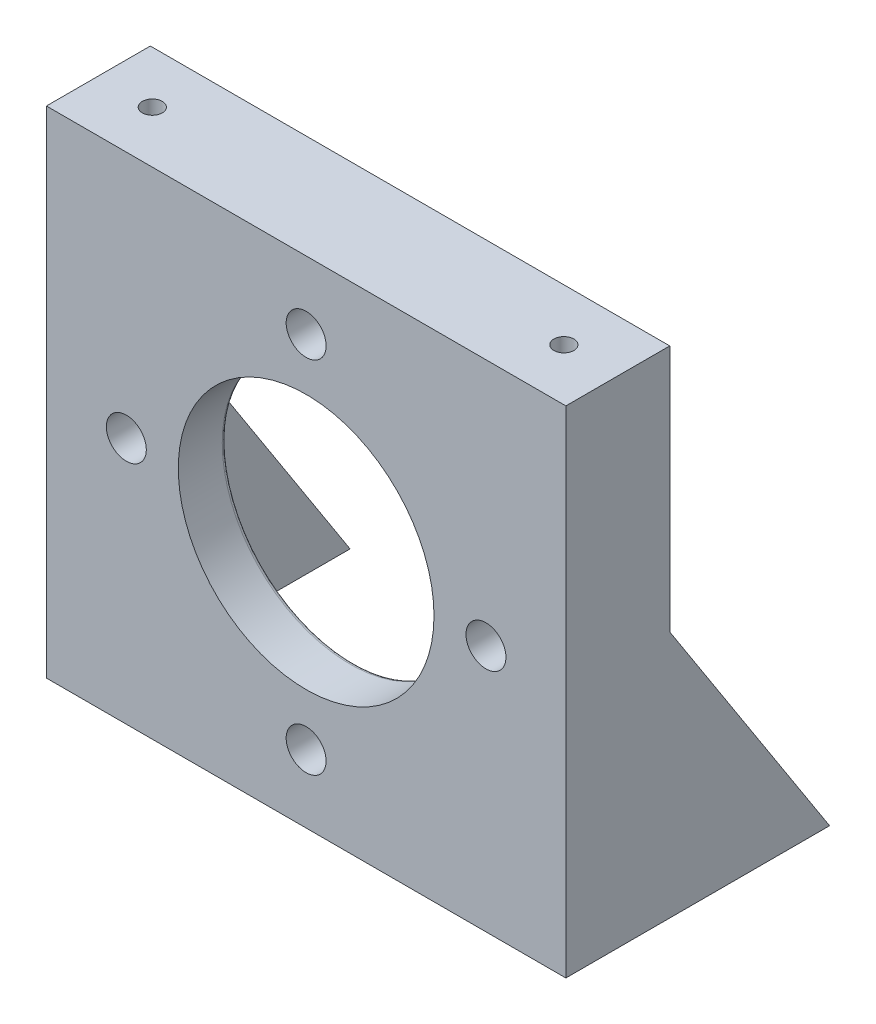
ISO-10303-21;
HEADER;
FILE_DESCRIPTION(('STEP AP214'),'2;1');
FILE_NAME('part.step','',(''),(''),'','','');
FILE_SCHEMA(('AUTOMOTIVE_DESIGN { 1 0 10303 214 1 1 1 1 }'));
ENDSEC;
DATA;
#1=APPLICATION_CONTEXT('core data for automotive mechanical design processes');
#2=APPLICATION_PROTOCOL_DEFINITION('international standard','automotive_design',2000,#1);
#3=PRODUCT_CONTEXT('',#1,'mechanical');
#4=PRODUCT('Part','Part','',(#3));
#5=PRODUCT_RELATED_PRODUCT_CATEGORY('part','',(#4));
#6=PRODUCT_DEFINITION_FORMATION('','',#4);
#7=PRODUCT_DEFINITION_CONTEXT('part definition',#1,'design');
#8=PRODUCT_DEFINITION('design','',#6,#7);
#9=PRODUCT_DEFINITION_SHAPE('','',#8);
#10=(LENGTH_UNIT() NAMED_UNIT(*) SI_UNIT(.MILLI.,.METRE.));
#11=(NAMED_UNIT(*) PLANE_ANGLE_UNIT() SI_UNIT($,.RADIAN.));
#12=(NAMED_UNIT(*) SI_UNIT($,.STERADIAN.) SOLID_ANGLE_UNIT());
#13=UNCERTAINTY_MEASURE_WITH_UNIT(LENGTH_MEASURE(1.E-05),#10,'distance_accuracy_value','');
#14=(GEOMETRIC_REPRESENTATION_CONTEXT(3) GLOBAL_UNCERTAINTY_ASSIGNED_CONTEXT((#13)) GLOBAL_UNIT_ASSIGNED_CONTEXT((#10,
#11,#12)) REPRESENTATION_CONTEXT('',''));
#15=CARTESIAN_POINT('',(0.,0.,0.));
#16=DIRECTION('',(0.,0.,1.));
#17=DIRECTION('',(1.,0.,0.));
#18=AXIS2_PLACEMENT_3D('',#15,#16,#17);
#19=CARTESIAN_POINT('',(0.,0.,-33.));
#20=DIRECTION('',(0.,0.,1.));
#21=DIRECTION('',(1.,0.,0.));
#22=AXIS2_PLACEMENT_3D('',#19,#20,#21);
#23=CYLINDRICAL_SURFACE('',#22,16.);
#24=CARTESIAN_POINT('',(0.,0.,-5.5));
#25=DIRECTION('',(0.,0.,-1.));
#26=DIRECTION('',(-1.,0.,0.));
#27=AXIS2_PLACEMENT_3D('',#24,#25,#26);
#28=CIRCLE('',#27,16.);
#29=CARTESIAN_POINT('',(-16.,0.,-5.5));
#30=VERTEX_POINT('',#29);
#31=EDGE_CURVE('E250',#30,#30,#28,.T.);
#32=ORIENTED_EDGE('',*,*,#31,.T.);
#33=EDGE_LOOP('',(#32));
#34=FACE_BOUND('',#33,.T.);
#35=CARTESIAN_POINT('',(0.,0.,0.));
#36=DIRECTION('',(0.,0.,1.));
#37=DIRECTION('',(1.,0.,0.));
#38=AXIS2_PLACEMENT_3D('',#35,#36,#37);
#39=CIRCLE('',#38,16.);
#40=CARTESIAN_POINT('',(16.,0.,0.));
#41=VERTEX_POINT('',#40);
#42=EDGE_CURVE('E172',#41,#41,#39,.T.);
#43=ORIENTED_EDGE('',*,*,#42,.T.);
#44=EDGE_LOOP('',(#43));
#45=FACE_BOUND('',#44,.T.);
#46=ADVANCED_FACE('F33',(#34,#45),#23,.F.);
#47=CARTESIAN_POINT('',(69.3917334913934,0.,-13.));
#48=DIRECTION('',(0.,-0.542126869822093,0.840296648224244));
#49=DIRECTION('',(0.,-0.840296648224244,-0.542126869822093));
#50=AXIS2_PLACEMENT_3D('',#47,#48,#49);
#51=PLANE('',#50);
#52=DIRECTION('',(-1.,0.,0.));
#53=VECTOR('',#52,1.);
#54=CARTESIAN_POINT('',(69.3917334913934,0.,-13.));
#55=LINE('',#54,#53);
#56=CARTESIAN_POINT('',(-27.5,0.,-13.));
#57=VERTEX_POINT('',#56);
#58=CARTESIAN_POINT('',(-32.5,0.,-13.));
#59=VERTEX_POINT('',#58);
#60=EDGE_CURVE('E53',#57,#59,#55,.T.);
#61=ORIENTED_EDGE('',*,*,#60,.F.);
#62=DIRECTION('',(0.,-0.840296648224244,-0.542126869822093));
#63=VECTOR('',#62,1.);
#64=CARTESIAN_POINT('',(-27.5,0.,-13.));
#65=LINE('',#64,#63);
#66=CARTESIAN_POINT('',(-27.5,-31.,-33.));
#67=VERTEX_POINT('',#66);
#68=EDGE_CURVE('E231',#57,#67,#65,.T.);
#69=ORIENTED_EDGE('',*,*,#68,.T.);
#70=DIRECTION('',(-1.,0.,0.));
#71=VECTOR('',#70,1.);
#72=CARTESIAN_POINT('',(69.3917334913934,-31.,-33.));
#73=LINE('',#72,#71);
#74=CARTESIAN_POINT('',(-32.5,-31.,-33.));
#75=VERTEX_POINT('',#74);
#76=EDGE_CURVE('E197',#67,#75,#73,.T.);
#77=ORIENTED_EDGE('',*,*,#76,.T.);
#78=DIRECTION('',(0.,0.840296648224244,0.542126869822093));
#79=VECTOR('',#78,1.);
#80=CARTESIAN_POINT('',(-32.5,0.,-13.));
#81=LINE('',#80,#79);
#82=EDGE_CURVE('E187',#75,#59,#81,.T.);
#83=ORIENTED_EDGE('',*,*,#82,.T.);
#84=EDGE_LOOP('',(#61,#69,#77,#83));
#85=FACE_BOUND('',#84,.T.);
#86=ADVANCED_FACE('F320',(#85),#51,.F.);
#87=CARTESIAN_POINT('',(0.,0.,-13.));
#88=DIRECTION('',(0.,0.,-1.));
#89=DIRECTION('',(-1.,0.,0.));
#90=AXIS2_PLACEMENT_3D('',#87,#88,#89);
#91=PLANE('',#90);
#92=CARTESIAN_POINT('',(0.,0.,-13.));
#93=DIRECTION('',(0.,0.,-1.));
#94=DIRECTION('',(-1.,0.,0.));
#95=AXIS2_PLACEMENT_3D('',#92,#93,#94);
#96=CIRCLE('',#95,26.5);
#97=CARTESIAN_POINT('',(-26.5,0.,-13.));
#98=VERTEX_POINT('',#97);
#99=EDGE_CURVE('E11',#98,#98,#96,.F.);
#100=ORIENTED_EDGE('',*,*,#99,.T.);
#101=EDGE_LOOP('',(#100));
#102=FACE_BOUND('',#101,.T.);
#103=DIRECTION('',(0.,1.,0.));
#104=VECTOR('',#103,1.);
#105=CARTESIAN_POINT('',(32.5,-31.,-13.));
#106=LINE('',#105,#104);
#107=CARTESIAN_POINT('',(32.5,0.,-13.));
#108=VERTEX_POINT('',#107);
#109=CARTESIAN_POINT('',(32.5,31.,-13.));
#110=VERTEX_POINT('',#109);
#111=EDGE_CURVE('E201',#108,#110,#106,.T.);
#112=ORIENTED_EDGE('',*,*,#111,.F.);
#113=CARTESIAN_POINT('',(27.5,0.,-13.));
#114=VERTEX_POINT('',#113);
#115=EDGE_CURVE('E198',#108,#114,#55,.T.);
#116=ORIENTED_EDGE('',*,*,#115,.T.);
#117=DIRECTION('',(0.,1.,0.));
#118=VECTOR('',#117,1.);
#119=CARTESIAN_POINT('',(27.5,-31.,-13.));
#120=LINE('',#119,#118);
#121=CARTESIAN_POINT('',(27.5,-31.,-13.));
#122=VERTEX_POINT('',#121);
#123=EDGE_CURVE('E185',#122,#114,#120,.T.);
#124=ORIENTED_EDGE('',*,*,#123,.F.);
#125=DIRECTION('',(1.,0.,0.));
#126=VECTOR('',#125,1.);
#127=CARTESIAN_POINT('',(27.5,-31.,-13.));
#128=LINE('',#127,#126);
#129=CARTESIAN_POINT('',(-27.5,-31.,-13.));
#130=VERTEX_POINT('',#129);
#131=EDGE_CURVE('E179',#130,#122,#128,.T.);
#132=ORIENTED_EDGE('',*,*,#131,.F.);
#133=DIRECTION('',(0.,1.,0.));
#134=VECTOR('',#133,1.);
#135=CARTESIAN_POINT('',(-27.5,-31.,-13.));
#136=LINE('',#135,#134);
#137=EDGE_CURVE('E48',#130,#57,#136,.T.);
#138=ORIENTED_EDGE('',*,*,#137,.T.);
#139=ORIENTED_EDGE('',*,*,#60,.T.);
#140=DIRECTION('',(0.,-1.,0.));
#141=VECTOR('',#140,1.);
#142=CARTESIAN_POINT('',(-32.5,-31.,-13.));
#143=LINE('',#142,#141);
#144=CARTESIAN_POINT('',(-32.5,31.,-13.));
#145=VERTEX_POINT('',#144);
#146=EDGE_CURVE('E207',#145,#59,#143,.T.);
#147=ORIENTED_EDGE('',*,*,#146,.F.);
#148=DIRECTION('',(-1.,0.,0.));
#149=VECTOR('',#148,1.);
#150=CARTESIAN_POINT('',(-32.5,31.,-13.));
#151=LINE('',#150,#149);
#152=EDGE_CURVE('E203',#110,#145,#151,.T.);
#153=ORIENTED_EDGE('',*,*,#152,.F.);
#154=EDGE_LOOP('',(#112,#116,#124,#132,#138,#139,#147,#153));
#155=FACE_BOUND('',#154,.T.);
#156=ADVANCED_FACE('F318',(#102,#155),#91,.T.);
#157=CARTESIAN_POINT('',(32.5,-31.,-13.));
#158=DIRECTION('',(1.,0.,0.));
#159=DIRECTION('',(0.,0.,-1.));
#160=AXIS2_PLACEMENT_3D('',#157,#158,#159);
#161=PLANE('',#160);
#162=DIRECTION('',(0.,1.,0.));
#163=VECTOR('',#162,1.);
#164=CARTESIAN_POINT('',(32.5,-31.,0.));
#165=LINE('',#164,#163);
#166=CARTESIAN_POINT('',(32.5,-31.,0.));
#167=VERTEX_POINT('',#166);
#168=CARTESIAN_POINT('',(32.5,31.,0.));
#169=VERTEX_POINT('',#168);
#170=EDGE_CURVE('E193',#167,#169,#165,.T.);
#171=ORIENTED_EDGE('',*,*,#170,.F.);
#172=DIRECTION('',(0.,0.,1.));
#173=VECTOR('',#172,1.);
#174=CARTESIAN_POINT('',(32.5,-31.,-13.));
#175=LINE('',#174,#173);
#176=CARTESIAN_POINT('',(32.5,-31.,-33.));
#177=VERTEX_POINT('',#176);
#178=EDGE_CURVE('E221',#177,#167,#175,.T.);
#179=ORIENTED_EDGE('',*,*,#178,.F.);
#180=DIRECTION('',(0.,0.840296648224244,0.542126869822093));
#181=VECTOR('',#180,1.);
#182=CARTESIAN_POINT('',(32.5,0.,-13.));
#183=LINE('',#182,#181);
#184=EDGE_CURVE('E190',#177,#108,#183,.T.);
#185=ORIENTED_EDGE('',*,*,#184,.T.);
#186=ORIENTED_EDGE('',*,*,#111,.T.);
#187=DIRECTION('',(0.,0.,1.));
#188=VECTOR('',#187,1.);
#189=CARTESIAN_POINT('',(32.5,31.,-13.));
#190=LINE('',#189,#188);
#191=EDGE_CURVE('E210',#110,#169,#190,.T.);
#192=ORIENTED_EDGE('',*,*,#191,.T.);
#193=EDGE_LOOP('',(#171,#179,#185,#186,#192));
#194=FACE_BOUND('',#193,.T.);
#195=ADVANCED_FACE('F301',(#194),#161,.T.);
#196=CARTESIAN_POINT('',(-32.5,-31.,-13.));
#197=DIRECTION('',(0.,-1.,0.));
#198=DIRECTION('',(0.,0.,-1.));
#199=AXIS2_PLACEMENT_3D('',#196,#197,#198);
#200=PLANE('',#199);
#201=CARTESIAN_POINT('',(-30.,-31.,-21.65));
#202=DIRECTION('',(0.,-1.,0.));
#203=DIRECTION('',(0.,0.,-1.));
#204=AXIS2_PLACEMENT_3D('',#201,#202,#203);
#205=CIRCLE('',#204,1.25);
#206=CARTESIAN_POINT('',(-30.,-31.,-22.9));
#207=VERTEX_POINT('',#206);
#208=EDGE_CURVE('E135',#207,#207,#205,.T.);
#209=ORIENTED_EDGE('',*,*,#208,.F.);
#210=EDGE_LOOP('',(#209));
#211=FACE_BOUND('',#210,.T.);
#212=CARTESIAN_POINT('',(30.,-31.,-21.65));
#213=DIRECTION('',(0.,-1.,0.));
#214=DIRECTION('',(0.,0.,-1.));
#215=AXIS2_PLACEMENT_3D('',#212,#213,#214);
#216=CIRCLE('',#215,1.25);
#217=CARTESIAN_POINT('',(30.,-31.,-22.9));
#218=VERTEX_POINT('',#217);
#219=EDGE_CURVE('E141',#218,#218,#216,.T.);
#220=ORIENTED_EDGE('',*,*,#219,.F.);
#221=EDGE_LOOP('',(#220));
#222=FACE_BOUND('',#221,.T.);
#223=CARTESIAN_POINT('',(-27.,-31.,-6.5));
#224=DIRECTION('',(0.,-1.,0.));
#225=DIRECTION('',(0.,0.,-1.));
#226=AXIS2_PLACEMENT_3D('',#223,#224,#225);
#227=CIRCLE('',#226,2.1);
#228=CARTESIAN_POINT('',(-27.,-31.,-8.6));
#229=VERTEX_POINT('',#228);
#230=EDGE_CURVE('E147',#229,#229,#227,.T.);
#231=ORIENTED_EDGE('',*,*,#230,.F.);
#232=EDGE_LOOP('',(#231));
#233=FACE_BOUND('',#232,.T.);
#234=CARTESIAN_POINT('',(27.,-31.,-6.5));
#235=DIRECTION('',(0.,-1.,0.));
#236=DIRECTION('',(0.,0.,-1.));
#237=AXIS2_PLACEMENT_3D('',#234,#235,#236);
#238=CIRCLE('',#237,2.1);
#239=CARTESIAN_POINT('',(27.,-31.,-8.6));
#240=VERTEX_POINT('',#239);
#241=EDGE_CURVE('E153',#240,#240,#238,.T.);
#242=ORIENTED_EDGE('',*,*,#241,.F.);
#243=EDGE_LOOP('',(#242));
#244=FACE_BOUND('',#243,.T.);
#245=DIRECTION('',(0.,0.,1.));
#246=VECTOR('',#245,1.);
#247=CARTESIAN_POINT('',(-27.5,-31.,-13.));
#248=LINE('',#247,#246);
#249=EDGE_CURVE('E175',#67,#130,#248,.T.);
#250=ORIENTED_EDGE('',*,*,#249,.T.);
#251=ORIENTED_EDGE('',*,*,#131,.T.);
#252=DIRECTION('',(0.,0.,-1.));
#253=VECTOR('',#252,1.);
#254=CARTESIAN_POINT('',(27.5,-31.,-13.));
#255=LINE('',#254,#253);
#256=CARTESIAN_POINT('',(27.5,-31.,-33.));
#257=VERTEX_POINT('',#256);
#258=EDGE_CURVE('E182',#122,#257,#255,.T.);
#259=ORIENTED_EDGE('',*,*,#258,.T.);
#260=EDGE_CURVE('E194',#177,#257,#73,.T.);
#261=ORIENTED_EDGE('',*,*,#260,.F.);
#262=ORIENTED_EDGE('',*,*,#178,.T.);
#263=DIRECTION('',(1.,0.,0.));
#264=VECTOR('',#263,1.);
#265=CARTESIAN_POINT('',(-32.5,-31.,0.));
#266=LINE('',#265,#264);
#267=CARTESIAN_POINT('',(-32.5,-31.,0.));
#268=VERTEX_POINT('',#267);
#269=EDGE_CURVE('E204',#268,#167,#266,.T.);
#270=ORIENTED_EDGE('',*,*,#269,.F.);
#271=DIRECTION('',(0.,0.,1.));
#272=VECTOR('',#271,1.);
#273=CARTESIAN_POINT('',(-32.5,-31.,-13.));
#274=LINE('',#273,#272);
#275=EDGE_CURVE('E224',#75,#268,#274,.T.);
#276=ORIENTED_EDGE('',*,*,#275,.F.);
#277=ORIENTED_EDGE('',*,*,#76,.F.);
#278=EDGE_LOOP('',(#250,#251,#259,#261,#262,#270,#276,#277));
#279=FACE_BOUND('',#278,.T.);
#280=ADVANCED_FACE('F313',(#211,#222,#233,#244,#279),#200,.T.);
#281=CARTESIAN_POINT('',(-32.5,-31.,-13.));
#282=DIRECTION('',(-1.,0.,0.));
#283=DIRECTION('',(0.,0.,1.));
#284=AXIS2_PLACEMENT_3D('',#281,#282,#283);
#285=PLANE('',#284);
#286=DIRECTION('',(0.,-1.,0.));
#287=VECTOR('',#286,1.);
#288=CARTESIAN_POINT('',(-32.5,-31.,0.));
#289=LINE('',#288,#287);
#290=CARTESIAN_POINT('',(-32.5,31.,0.));
#291=VERTEX_POINT('',#290);
#292=EDGE_CURVE('E216',#291,#268,#289,.T.);
#293=ORIENTED_EDGE('',*,*,#292,.F.);
#294=DIRECTION('',(0.,0.,1.));
#295=VECTOR('',#294,1.);
#296=CARTESIAN_POINT('',(-32.5,31.,-13.));
#297=LINE('',#296,#295);
#298=EDGE_CURVE('E226',#145,#291,#297,.T.);
#299=ORIENTED_EDGE('',*,*,#298,.F.);
#300=ORIENTED_EDGE('',*,*,#146,.T.);
#301=ORIENTED_EDGE('',*,*,#82,.F.);
#302=ORIENTED_EDGE('',*,*,#275,.T.);
#303=EDGE_LOOP('',(#293,#299,#300,#301,#302));
#304=FACE_BOUND('',#303,.T.);
#305=ADVANCED_FACE('F309',(#304),#285,.T.);
#306=CARTESIAN_POINT('',(-32.5,31.,-13.));
#307=DIRECTION('',(0.,1.,0.));
#308=DIRECTION('',(0.,0.,1.));
#309=AXIS2_PLACEMENT_3D('',#306,#307,#308);
#310=PLANE('',#309);
#311=CARTESIAN_POINT('',(25.75,31.,-6.49999999999998));
#312=DIRECTION('',(0.,1.,0.));
#313=DIRECTION('',(0.,0.,1.));
#314=AXIS2_PLACEMENT_3D('',#311,#312,#313);
#315=CIRCLE('',#314,1.24999999999999);
#316=CARTESIAN_POINT('',(25.75,31.,-5.24999999999999));
#317=VERTEX_POINT('',#316);
#318=EDGE_CURVE('E125',#317,#317,#315,.T.);
#319=ORIENTED_EDGE('',*,*,#318,.F.);
#320=EDGE_LOOP('',(#319));
#321=FACE_BOUND('',#320,.T.);
#322=CARTESIAN_POINT('',(-25.75,31.,-6.5));
#323=DIRECTION('',(0.,1.,0.));
#324=DIRECTION('',(0.,0.,1.));
#325=AXIS2_PLACEMENT_3D('',#322,#323,#324);
#326=CIRCLE('',#325,1.24999999999999);
#327=CARTESIAN_POINT('',(-25.75,31.,-5.25000000000001));
#328=VERTEX_POINT('',#327);
#329=EDGE_CURVE('E124',#328,#328,#326,.T.);
#330=ORIENTED_EDGE('',*,*,#329,.F.);
#331=EDGE_LOOP('',(#330));
#332=FACE_BOUND('',#331,.T.);
#333=DIRECTION('',(-1.,0.,0.));
#334=VECTOR('',#333,1.);
#335=CARTESIAN_POINT('',(-32.5,31.,0.));
#336=LINE('',#335,#334);
#337=EDGE_CURVE('E213',#169,#291,#336,.T.);
#338=ORIENTED_EDGE('',*,*,#337,.F.);
#339=ORIENTED_EDGE('',*,*,#191,.F.);
#340=ORIENTED_EDGE('',*,*,#152,.T.);
#341=ORIENTED_EDGE('',*,*,#298,.T.);
#342=EDGE_LOOP('',(#338,#339,#340,#341));
#343=FACE_BOUND('',#342,.T.);
#344=ADVANCED_FACE('F292',(#321,#332,#343),#310,.T.);
#345=CARTESIAN_POINT('',(0.,0.,0.));
#346=DIRECTION('',(0.,0.,-1.));
#347=DIRECTION('',(-1.,0.,0.));
#348=AXIS2_PLACEMENT_3D('',#345,#346,#347);
#349=PLANE('',#348);
#350=CARTESIAN_POINT('',(0.,22.5,0.));
#351=DIRECTION('',(0.,0.,1.));
#352=DIRECTION('',(1.,0.,0.));
#353=AXIS2_PLACEMENT_3D('',#350,#351,#352);
#354=CIRCLE('',#353,2.5);
#355=CARTESIAN_POINT('',(2.5,22.5,0.));
#356=VERTEX_POINT('',#355);
#357=EDGE_CURVE('E160',#356,#356,#354,.T.);
#358=ORIENTED_EDGE('',*,*,#357,.F.);
#359=EDGE_LOOP('',(#358));
#360=FACE_BOUND('',#359,.T.);
#361=CARTESIAN_POINT('',(22.5,0.,0.));
#362=DIRECTION('',(0.,0.,1.));
#363=DIRECTION('',(1.,0.,0.));
#364=AXIS2_PLACEMENT_3D('',#361,#362,#363);
#365=CIRCLE('',#364,2.5);
#366=CARTESIAN_POINT('',(25.,0.,0.));
#367=VERTEX_POINT('',#366);
#368=EDGE_CURVE('E164',#367,#367,#365,.T.);
#369=ORIENTED_EDGE('',*,*,#368,.F.);
#370=EDGE_LOOP('',(#369));
#371=FACE_BOUND('',#370,.T.);
#372=CARTESIAN_POINT('',(-1.57116660247941E-13,-22.5,0.));
#373=DIRECTION('',(0.,0.,1.));
#374=DIRECTION('',(1.,0.,0.));
#375=AXIS2_PLACEMENT_3D('',#372,#373,#374);
#376=CIRCLE('',#375,2.5);
#377=CARTESIAN_POINT('',(2.49999999999984,-22.5,0.));
#378=VERTEX_POINT('',#377);
#379=EDGE_CURVE('E167',#378,#378,#376,.T.);
#380=ORIENTED_EDGE('',*,*,#379,.F.);
#381=EDGE_LOOP('',(#380));
#382=FACE_BOUND('',#381,.T.);
#383=CARTESIAN_POINT('',(-22.5,2.35674990371912E-13,0.));
#384=DIRECTION('',(0.,0.,1.));
#385=DIRECTION('',(1.,0.,0.));
#386=AXIS2_PLACEMENT_3D('',#383,#384,#385);
#387=CIRCLE('',#386,2.5);
#388=CARTESIAN_POINT('',(-20.,2.35674990371912E-13,0.));
#389=VERTEX_POINT('',#388);
#390=EDGE_CURVE('E159',#389,#389,#387,.T.);
#391=ORIENTED_EDGE('',*,*,#390,.F.);
#392=EDGE_LOOP('',(#391));
#393=FACE_BOUND('',#392,.T.);
#394=ORIENTED_EDGE('',*,*,#42,.F.);
#395=EDGE_LOOP('',(#394));
#396=FACE_BOUND('',#395,.T.);
#397=ORIENTED_EDGE('',*,*,#170,.T.);
#398=ORIENTED_EDGE('',*,*,#337,.T.);
#399=ORIENTED_EDGE('',*,*,#292,.T.);
#400=ORIENTED_EDGE('',*,*,#269,.T.);
#401=EDGE_LOOP('',(#397,#398,#399,#400));
#402=FACE_BOUND('',#401,.T.);
#403=ADVANCED_FACE('F288',(#360,#371,#382,#393,#396,#402),#349,.F.);
#404=ORIENTED_EDGE('',*,*,#260,.T.);
#405=DIRECTION('',(0.,0.840296648224244,0.542126869822093));
#406=VECTOR('',#405,1.);
#407=CARTESIAN_POINT('',(27.5,0.,-13.));
#408=LINE('',#407,#406);
#409=EDGE_CURVE('E223',#257,#114,#408,.T.);
#410=ORIENTED_EDGE('',*,*,#409,.T.);
#411=ORIENTED_EDGE('',*,*,#115,.F.);
#412=ORIENTED_EDGE('',*,*,#184,.F.);
#413=EDGE_LOOP('',(#404,#410,#411,#412));
#414=FACE_BOUND('',#413,.T.);
#415=ADVANCED_FACE('F291',(#414),#51,.F.);
#416=CARTESIAN_POINT('',(-27.5,-31.,-13.));
#417=DIRECTION('',(-1.,0.,0.));
#418=DIRECTION('',(0.,0.,1.));
#419=AXIS2_PLACEMENT_3D('',#416,#417,#418);
#420=PLANE('',#419);
#421=ORIENTED_EDGE('',*,*,#137,.F.);
#422=ORIENTED_EDGE('',*,*,#249,.F.);
#423=ORIENTED_EDGE('',*,*,#68,.F.);
#424=EDGE_LOOP('',(#421,#422,#423));
#425=FACE_BOUND('',#424,.T.);
#426=ADVANCED_FACE('F322',(#425),#420,.F.);
#427=CARTESIAN_POINT('',(27.5,-31.,-13.));
#428=DIRECTION('',(1.,0.,0.));
#429=DIRECTION('',(0.,0.,-1.));
#430=AXIS2_PLACEMENT_3D('',#427,#428,#429);
#431=PLANE('',#430);
#432=ORIENTED_EDGE('',*,*,#258,.F.);
#433=ORIENTED_EDGE('',*,*,#123,.T.);
#434=ORIENTED_EDGE('',*,*,#409,.F.);
#435=EDGE_LOOP('',(#432,#433,#434));
#436=FACE_BOUND('',#435,.T.);
#437=ADVANCED_FACE('F270',(#436),#431,.F.);
#438=CARTESIAN_POINT('',(0.,0.,-6.));
#439=DIRECTION('',(0.,0.,-1.));
#440=DIRECTION('',(-1.,0.,0.));
#441=AXIS2_PLACEMENT_3D('',#438,#439,#440);
#442=PLANE('',#441);
#443=CARTESIAN_POINT('',(0.,0.,-6.));
#444=DIRECTION('',(0.,0.,-1.));
#445=DIRECTION('',(-1.,0.,0.));
#446=AXIS2_PLACEMENT_3D('',#443,#444,#445);
#447=CIRCLE('',#446,16.5);
#448=CARTESIAN_POINT('',(-16.5,0.,-6.));
#449=VERTEX_POINT('',#448);
#450=EDGE_CURVE('E247',#449,#449,#447,.F.);
#451=ORIENTED_EDGE('',*,*,#450,.T.);
#452=EDGE_LOOP('',(#451));
#453=FACE_BOUND('',#452,.T.);
#454=CARTESIAN_POINT('',(0.,0.,-6.));
#455=DIRECTION('',(0.,0.,-1.));
#456=DIRECTION('',(-1.,0.,0.));
#457=AXIS2_PLACEMENT_3D('',#454,#455,#456);
#458=CIRCLE('',#457,25.5);
#459=CARTESIAN_POINT('',(-25.5,0.,-6.));
#460=VERTEX_POINT('',#459);
#461=EDGE_CURVE('E234',#460,#460,#458,.T.);
#462=ORIENTED_EDGE('',*,*,#461,.T.);
#463=EDGE_LOOP('',(#462));
#464=FACE_BOUND('',#463,.T.);
#465=CARTESIAN_POINT('',(0.,22.5,-6.));
#466=DIRECTION('',(0.,0.,-1.));
#467=DIRECTION('',(-1.,0.,0.));
#468=AXIS2_PLACEMENT_3D('',#465,#466,#467);
#469=CIRCLE('',#468,2.5);
#470=CARTESIAN_POINT('',(-2.5,22.5,-6.));
#471=VERTEX_POINT('',#470);
#472=EDGE_CURVE('E176',#471,#471,#469,.T.);
#473=ORIENTED_EDGE('',*,*,#472,.F.);
#474=EDGE_LOOP('',(#473));
#475=FACE_BOUND('',#474,.T.);
#476=CARTESIAN_POINT('',(22.5,0.,-6.));
#477=DIRECTION('',(0.,0.,-1.));
#478=DIRECTION('',(-1.,0.,0.));
#479=AXIS2_PLACEMENT_3D('',#476,#477,#478);
#480=CIRCLE('',#479,2.5);
#481=CARTESIAN_POINT('',(20.,0.,-6.));
#482=VERTEX_POINT('',#481);
#483=EDGE_CURVE('E240',#482,#482,#480,.T.);
#484=ORIENTED_EDGE('',*,*,#483,.F.);
#485=EDGE_LOOP('',(#484));
#486=FACE_BOUND('',#485,.T.);
#487=CARTESIAN_POINT('',(-1.57116660247941E-13,-22.5,-6.));
#488=DIRECTION('',(0.,0.,-1.));
#489=DIRECTION('',(-1.,0.,0.));
#490=AXIS2_PLACEMENT_3D('',#487,#488,#489);
#491=CIRCLE('',#490,2.5);
#492=CARTESIAN_POINT('',(-2.50000000000016,-22.5,-6.));
#493=VERTEX_POINT('',#492);
#494=EDGE_CURVE('E237',#493,#493,#491,.T.);
#495=ORIENTED_EDGE('',*,*,#494,.F.);
#496=EDGE_LOOP('',(#495));
#497=FACE_BOUND('',#496,.T.);
#498=CARTESIAN_POINT('',(-22.5,2.35674990371912E-13,-6.));
#499=DIRECTION('',(0.,0.,-1.));
#500=DIRECTION('',(-1.,0.,0.));
#501=AXIS2_PLACEMENT_3D('',#498,#499,#500);
#502=CIRCLE('',#501,2.5);
#503=CARTESIAN_POINT('',(-25.,2.35674990371912E-13,-6.));
#504=VERTEX_POINT('',#503);
#505=EDGE_CURVE('E163',#504,#504,#502,.T.);
#506=ORIENTED_EDGE('',*,*,#505,.F.);
#507=EDGE_LOOP('',(#506));
#508=FACE_BOUND('',#507,.T.);
#509=ADVANCED_FACE('F267',(#453,#464,#475,#486,#497,#508),#442,.T.);
#510=CARTESIAN_POINT('',(0.,0.,-6.));
#511=DIRECTION('',(0.,0.,-1.));
#512=DIRECTION('',(-1.,0.,0.));
#513=AXIS2_PLACEMENT_3D('',#510,#511,#512);
#514=CYLINDRICAL_SURFACE('',#513,26.);
#515=CARTESIAN_POINT('',(0.,0.,-6.5));
#516=DIRECTION('',(0.,0.,-1.));
#517=DIRECTION('',(-1.,0.,0.));
#518=AXIS2_PLACEMENT_3D('',#515,#516,#517);
#519=CIRCLE('',#518,26.);
#520=CARTESIAN_POINT('',(-26.,0.,-6.5));
#521=VERTEX_POINT('',#520);
#522=EDGE_CURVE('E41',#521,#521,#519,.F.);
#523=ORIENTED_EDGE('',*,*,#522,.T.);
#524=EDGE_LOOP('',(#523));
#525=FACE_BOUND('',#524,.T.);
#526=CARTESIAN_POINT('',(0.,0.,-12.5));
#527=DIRECTION('',(0.,0.,-1.));
#528=DIRECTION('',(-1.,0.,0.));
#529=AXIS2_PLACEMENT_3D('',#526,#527,#528);
#530=CIRCLE('',#529,26.);
#531=CARTESIAN_POINT('',(-26.,0.,-12.5));
#532=VERTEX_POINT('',#531);
#533=EDGE_CURVE('E253',#532,#532,#530,.T.);
#534=ORIENTED_EDGE('',*,*,#533,.T.);
#535=EDGE_LOOP('',(#534));
#536=FACE_BOUND('',#535,.T.);
#537=ADVANCED_FACE('F258',(#525,#536),#514,.F.);
#538=CARTESIAN_POINT('',(-22.5,2.35674990371912E-13,-33.));
#539=DIRECTION('',(0.,0.,1.));
#540=DIRECTION('',(1.,0.,0.));
#541=AXIS2_PLACEMENT_3D('',#538,#539,#540);
#542=CYLINDRICAL_SURFACE('',#541,2.5);
#543=ORIENTED_EDGE('',*,*,#505,.T.);
#544=EDGE_LOOP('',(#543));
#545=FACE_BOUND('',#544,.T.);
#546=ORIENTED_EDGE('',*,*,#390,.T.);
#547=EDGE_LOOP('',(#546));
#548=FACE_BOUND('',#547,.T.);
#549=ADVANCED_FACE('F281',(#545,#548),#542,.F.);
#550=CARTESIAN_POINT('',(-1.57116660247941E-13,-22.5,-33.));
#551=DIRECTION('',(0.,0.,1.));
#552=DIRECTION('',(1.,0.,0.));
#553=AXIS2_PLACEMENT_3D('',#550,#551,#552);
#554=CYLINDRICAL_SURFACE('',#553,2.5);
#555=ORIENTED_EDGE('',*,*,#494,.T.);
#556=EDGE_LOOP('',(#555));
#557=FACE_BOUND('',#556,.T.);
#558=ORIENTED_EDGE('',*,*,#379,.T.);
#559=EDGE_LOOP('',(#558));
#560=FACE_BOUND('',#559,.T.);
#561=ADVANCED_FACE('F284',(#557,#560),#554,.F.);
#562=CARTESIAN_POINT('',(22.5,0.,-33.));
#563=DIRECTION('',(0.,0.,1.));
#564=DIRECTION('',(1.,0.,0.));
#565=AXIS2_PLACEMENT_3D('',#562,#563,#564);
#566=CYLINDRICAL_SURFACE('',#565,2.5);
#567=ORIENTED_EDGE('',*,*,#483,.T.);
#568=EDGE_LOOP('',(#567));
#569=FACE_BOUND('',#568,.T.);
#570=ORIENTED_EDGE('',*,*,#368,.T.);
#571=EDGE_LOOP('',(#570));
#572=FACE_BOUND('',#571,.T.);
#573=ADVANCED_FACE('F343',(#569,#572),#566,.F.);
#574=CARTESIAN_POINT('',(0.,22.5,-33.));
#575=DIRECTION('',(0.,0.,1.));
#576=DIRECTION('',(1.,0.,0.));
#577=AXIS2_PLACEMENT_3D('',#574,#575,#576);
#578=CYLINDRICAL_SURFACE('',#577,2.5);
#579=ORIENTED_EDGE('',*,*,#472,.T.);
#580=EDGE_LOOP('',(#579));
#581=FACE_BOUND('',#580,.T.);
#582=ORIENTED_EDGE('',*,*,#357,.T.);
#583=EDGE_LOOP('',(#582));
#584=FACE_BOUND('',#583,.T.);
#585=ADVANCED_FACE('F347',(#581,#584),#578,.F.);
#586=CARTESIAN_POINT('',(0.,0.,-5.5));
#587=DIRECTION('',(0.,0.,-1.));
#588=DIRECTION('',(-1.,0.,0.));
#589=AXIS2_PLACEMENT_3D('',#586,#587,#588);
#590=TOROIDAL_SURFACE('',#589,16.5,0.5);
#591=ORIENTED_EDGE('',*,*,#31,.F.);
#592=EDGE_LOOP('',(#591));
#593=FACE_BOUND('',#592,.T.);
#594=ORIENTED_EDGE('',*,*,#450,.F.);
#595=EDGE_LOOP('',(#594));
#596=FACE_BOUND('',#595,.T.);
#597=ADVANCED_FACE('F264',(#593,#596),#590,.T.);
#598=CARTESIAN_POINT('',(0.,0.,-6.5));
#599=DIRECTION('',(0.,0.,-1.));
#600=DIRECTION('',(-1.,0.,0.));
#601=AXIS2_PLACEMENT_3D('',#598,#599,#600);
#602=TOROIDAL_SURFACE('',#601,25.5,0.5);
#603=ORIENTED_EDGE('',*,*,#522,.F.);
#604=EDGE_LOOP('',(#603));
#605=FACE_BOUND('',#604,.T.);
#606=ORIENTED_EDGE('',*,*,#461,.F.);
#607=EDGE_LOOP('',(#606));
#608=FACE_BOUND('',#607,.T.);
#609=ADVANCED_FACE('F261',(#605,#608),#602,.F.);
#610=CARTESIAN_POINT('',(0.,0.,-12.5));
#611=DIRECTION('',(0.,0.,-1.));
#612=DIRECTION('',(-1.,0.,0.));
#613=AXIS2_PLACEMENT_3D('',#610,#611,#612);
#614=TOROIDAL_SURFACE('',#613,26.5,0.5);
#615=ORIENTED_EDGE('',*,*,#99,.F.);
#616=EDGE_LOOP('',(#615));
#617=FACE_BOUND('',#616,.T.);
#618=ORIENTED_EDGE('',*,*,#533,.F.);
#619=EDGE_LOOP('',(#618));
#620=FACE_BOUND('',#619,.T.);
#621=ADVANCED_FACE('F35',(#617,#620),#614,.T.);
#622=CARTESIAN_POINT('',(27.,-16.,-6.5));
#623=DIRECTION('',(0.,-1.,0.));
#624=DIRECTION('',(0.,0.,-1.));
#625=AXIS2_PLACEMENT_3D('',#622,#623,#624);
#626=CONICAL_SURFACE('',#625,2.1,1.02974425867665);
#627=CARTESIAN_POINT('',(27.,-14.7381927000421,-6.5));
#628=VERTEX_POINT('',#627);
#629=VERTEX_LOOP('',#628);
#630=FACE_BOUND('',#629,.T.);
#631=CARTESIAN_POINT('',(27.,-16.,-6.5));
#632=DIRECTION('',(0.,-1.,0.));
#633=DIRECTION('',(0.,0.,-1.));
#634=AXIS2_PLACEMENT_3D('',#631,#632,#633);
#635=CIRCLE('',#634,2.1);
#636=CARTESIAN_POINT('',(27.,-16.,-8.6));
#637=VERTEX_POINT('',#636);
#638=EDGE_CURVE('E156',#637,#637,#635,.T.);
#639=ORIENTED_EDGE('',*,*,#638,.T.);
#640=EDGE_LOOP('',(#639));
#641=FACE_BOUND('',#640,.T.);
#642=ADVANCED_FACE('F352',(#630,#641),#626,.F.);
#643=CARTESIAN_POINT('',(27.,-31.,-6.5));
#644=DIRECTION('',(0.,-1.,0.));
#645=DIRECTION('',(0.,0.,-1.));
#646=AXIS2_PLACEMENT_3D('',#643,#644,#645);
#647=CYLINDRICAL_SURFACE('',#646,2.1);
#648=ORIENTED_EDGE('',*,*,#638,.F.);
#649=EDGE_LOOP('',(#648));
#650=FACE_BOUND('',#649,.T.);
#651=ORIENTED_EDGE('',*,*,#241,.T.);
#652=EDGE_LOOP('',(#651));
#653=FACE_BOUND('',#652,.T.);
#654=ADVANCED_FACE('F355',(#650,#653),#647,.F.);
#655=CARTESIAN_POINT('',(-27.,-16.,-6.5));
#656=DIRECTION('',(0.,-1.,0.));
#657=DIRECTION('',(0.,0.,-1.));
#658=AXIS2_PLACEMENT_3D('',#655,#656,#657);
#659=CONICAL_SURFACE('',#658,2.1,1.02974425867665);
#660=CARTESIAN_POINT('',(-27.,-14.7381927000421,-6.5));
#661=VERTEX_POINT('',#660);
#662=VERTEX_LOOP('',#661);
#663=FACE_BOUND('',#662,.T.);
#664=CARTESIAN_POINT('',(-27.,-16.,-6.5));
#665=DIRECTION('',(0.,-1.,0.));
#666=DIRECTION('',(0.,0.,-1.));
#667=AXIS2_PLACEMENT_3D('',#664,#665,#666);
#668=CIRCLE('',#667,2.1);
#669=CARTESIAN_POINT('',(-27.,-16.,-8.6));
#670=VERTEX_POINT('',#669);
#671=EDGE_CURVE('E150',#670,#670,#668,.T.);
#672=ORIENTED_EDGE('',*,*,#671,.T.);
#673=EDGE_LOOP('',(#672));
#674=FACE_BOUND('',#673,.T.);
#675=ADVANCED_FACE('F359',(#663,#674),#659,.F.);
#676=CARTESIAN_POINT('',(-27.,-31.,-6.5));
#677=DIRECTION('',(0.,-1.,0.));
#678=DIRECTION('',(0.,0.,-1.));
#679=AXIS2_PLACEMENT_3D('',#676,#677,#678);
#680=CYLINDRICAL_SURFACE('',#679,2.1);
#681=ORIENTED_EDGE('',*,*,#671,.F.);
#682=EDGE_LOOP('',(#681));
#683=FACE_BOUND('',#682,.T.);
#684=ORIENTED_EDGE('',*,*,#230,.T.);
#685=EDGE_LOOP('',(#684));
#686=FACE_BOUND('',#685,.T.);
#687=ADVANCED_FACE('F363',(#683,#686),#680,.F.);
#688=CARTESIAN_POINT('',(30.,-21.,-21.65));
#689=DIRECTION('',(0.,-1.,0.));
#690=DIRECTION('',(0.,0.,-1.));
#691=AXIS2_PLACEMENT_3D('',#688,#689,#690);
#692=CONICAL_SURFACE('',#691,1.24999999999999,1.02974425867665);
#693=CARTESIAN_POINT('',(30.,-20.2489242262155,-21.65));
#694=VERTEX_POINT('',#693);
#695=VERTEX_LOOP('',#694);
#696=FACE_BOUND('',#695,.T.);
#697=CARTESIAN_POINT('',(30.,-21.,-21.65));
#698=DIRECTION('',(0.,-1.,0.));
#699=DIRECTION('',(0.,0.,-1.));
#700=AXIS2_PLACEMENT_3D('',#697,#698,#699);
#701=CIRCLE('',#700,1.24999999999999);
#702=CARTESIAN_POINT('',(30.,-21.,-22.9));
#703=VERTEX_POINT('',#702);
#704=EDGE_CURVE('E144',#703,#703,#701,.T.);
#705=ORIENTED_EDGE('',*,*,#704,.T.);
#706=EDGE_LOOP('',(#705));
#707=FACE_BOUND('',#706,.T.);
#708=ADVANCED_FACE('F367',(#696,#707),#692,.F.);
#709=CARTESIAN_POINT('',(30.,-31.,-21.65));
#710=DIRECTION('',(0.,-1.,0.));
#711=DIRECTION('',(0.,0.,-1.));
#712=AXIS2_PLACEMENT_3D('',#709,#710,#711);
#713=CYLINDRICAL_SURFACE('',#712,1.25);
#714=ORIENTED_EDGE('',*,*,#704,.F.);
#715=EDGE_LOOP('',(#714));
#716=FACE_BOUND('',#715,.T.);
#717=ORIENTED_EDGE('',*,*,#219,.T.);
#718=EDGE_LOOP('',(#717));
#719=FACE_BOUND('',#718,.T.);
#720=ADVANCED_FACE('F371',(#716,#719),#713,.F.);
#721=CARTESIAN_POINT('',(-30.,-21.,-21.65));
#722=DIRECTION('',(0.,-1.,0.));
#723=DIRECTION('',(0.,0.,-1.));
#724=AXIS2_PLACEMENT_3D('',#721,#722,#723);
#725=CONICAL_SURFACE('',#724,1.25,1.02974425867665);
#726=CARTESIAN_POINT('',(-30.,-20.2489242262155,-21.65));
#727=VERTEX_POINT('',#726);
#728=VERTEX_LOOP('',#727);
#729=FACE_BOUND('',#728,.T.);
#730=CARTESIAN_POINT('',(-30.,-21.,-21.65));
#731=DIRECTION('',(0.,-1.,0.));
#732=DIRECTION('',(0.,0.,-1.));
#733=AXIS2_PLACEMENT_3D('',#730,#731,#732);
#734=CIRCLE('',#733,1.25);
#735=CARTESIAN_POINT('',(-30.,-21.,-22.9));
#736=VERTEX_POINT('',#735);
#737=EDGE_CURVE('E138',#736,#736,#734,.T.);
#738=ORIENTED_EDGE('',*,*,#737,.T.);
#739=EDGE_LOOP('',(#738));
#740=FACE_BOUND('',#739,.T.);
#741=ADVANCED_FACE('F375',(#729,#740),#725,.F.);
#742=CARTESIAN_POINT('',(-30.,-31.,-21.65));
#743=DIRECTION('',(0.,-1.,0.));
#744=DIRECTION('',(0.,0.,-1.));
#745=AXIS2_PLACEMENT_3D('',#742,#743,#744);
#746=CYLINDRICAL_SURFACE('',#745,1.25);
#747=ORIENTED_EDGE('',*,*,#737,.F.);
#748=EDGE_LOOP('',(#747));
#749=FACE_BOUND('',#748,.T.);
#750=ORIENTED_EDGE('',*,*,#208,.T.);
#751=EDGE_LOOP('',(#750));
#752=FACE_BOUND('',#751,.T.);
#753=ADVANCED_FACE('F379',(#749,#752),#746,.F.);
#754=CARTESIAN_POINT('',(-25.75,21.,-6.5));
#755=DIRECTION('',(0.,1.,0.));
#756=DIRECTION('',(0.,0.,1.));
#757=AXIS2_PLACEMENT_3D('',#754,#755,#756);
#758=CONICAL_SURFACE('',#757,1.24999999999999,1.02974425867664);
#759=CARTESIAN_POINT('',(-25.75,20.2489242262155,-6.5));
#760=VERTEX_POINT('',#759);
#761=VERTEX_LOOP('',#760);
#762=FACE_BOUND('',#761,.T.);
#763=CARTESIAN_POINT('',(-25.75,21.,-6.5));
#764=DIRECTION('',(0.,1.,0.));
#765=DIRECTION('',(0.,0.,1.));
#766=AXIS2_PLACEMENT_3D('',#763,#764,#765);
#767=CIRCLE('',#766,1.24999999999999);
#768=CARTESIAN_POINT('',(-25.75,21.,-5.25000000000001));
#769=VERTEX_POINT('',#768);
#770=EDGE_CURVE('E128',#769,#769,#767,.T.);
#771=ORIENTED_EDGE('',*,*,#770,.T.);
#772=EDGE_LOOP('',(#771));
#773=FACE_BOUND('',#772,.T.);
#774=ADVANCED_FACE('F383',(#762,#773),#758,.F.);
#775=CARTESIAN_POINT('',(-25.75,31.,-6.5));
#776=DIRECTION('',(0.,1.,0.));
#777=DIRECTION('',(0.,0.,1.));
#778=AXIS2_PLACEMENT_3D('',#775,#776,#777);
#779=CYLINDRICAL_SURFACE('',#778,1.24999999999999);
#780=ORIENTED_EDGE('',*,*,#770,.F.);
#781=EDGE_LOOP('',(#780));
#782=FACE_BOUND('',#781,.T.);
#783=ORIENTED_EDGE('',*,*,#329,.T.);
#784=EDGE_LOOP('',(#783));
#785=FACE_BOUND('',#784,.T.);
#786=ADVANCED_FACE('F118',(#782,#785),#779,.F.);
#787=CARTESIAN_POINT('',(25.75,21.,-6.49999999999998));
#788=DIRECTION('',(0.,1.,0.));
#789=DIRECTION('',(0.,0.,1.));
#790=AXIS2_PLACEMENT_3D('',#787,#788,#789);
#791=CONICAL_SURFACE('',#790,1.24999999999999,1.02974425867664);
#792=CARTESIAN_POINT('',(25.75,20.2489242262155,-6.49999999999998));
#793=VERTEX_POINT('',#792);
#794=VERTEX_LOOP('',#793);
#795=FACE_BOUND('',#794,.T.);
#796=CARTESIAN_POINT('',(25.75,21.,-6.49999999999998));
#797=DIRECTION('',(0.,1.,0.));
#798=DIRECTION('',(0.,0.,1.));
#799=AXIS2_PLACEMENT_3D('',#796,#797,#798);
#800=CIRCLE('',#799,1.24999999999999);
#801=CARTESIAN_POINT('',(25.75,21.,-5.24999999999999));
#802=VERTEX_POINT('',#801);
#803=EDGE_CURVE('E122',#802,#802,#800,.T.);
#804=ORIENTED_EDGE('',*,*,#803,.T.);
#805=EDGE_LOOP('',(#804));
#806=FACE_BOUND('',#805,.T.);
#807=ADVANCED_FACE('F114',(#795,#806),#791,.F.);
#808=CARTESIAN_POINT('',(25.75,31.,-6.49999999999998));
#809=DIRECTION('',(0.,1.,0.));
#810=DIRECTION('',(0.,0.,1.));
#811=AXIS2_PLACEMENT_3D('',#808,#809,#810);
#812=CYLINDRICAL_SURFACE('',#811,1.24999999999999);
#813=ORIENTED_EDGE('',*,*,#803,.F.);
#814=EDGE_LOOP('',(#813));
#815=FACE_BOUND('',#814,.T.);
#816=ORIENTED_EDGE('',*,*,#318,.T.);
#817=EDGE_LOOP('',(#816));
#818=FACE_BOUND('',#817,.T.);
#819=ADVANCED_FACE('F117',(#815,#818),#812,.F.);
#820=CLOSED_SHELL('',(#46,#86,#156,#195,#280,#305,#344,#403,#415,#426,#437,#509,#537,#549,#561,
#573,#585,#597,#609,#621,#642,#654,#675,#687,#708,#720,#741,#753,#774,#786,#807,#819));
#821=MANIFOLD_SOLID_BREP('B2',#820);
#822=ADVANCED_BREP_SHAPE_REPRESENTATION('',(#18,#821),#14);
#823=SHAPE_DEFINITION_REPRESENTATION(#9,#822);
ENDSEC;
END-ISO-10303-21;
